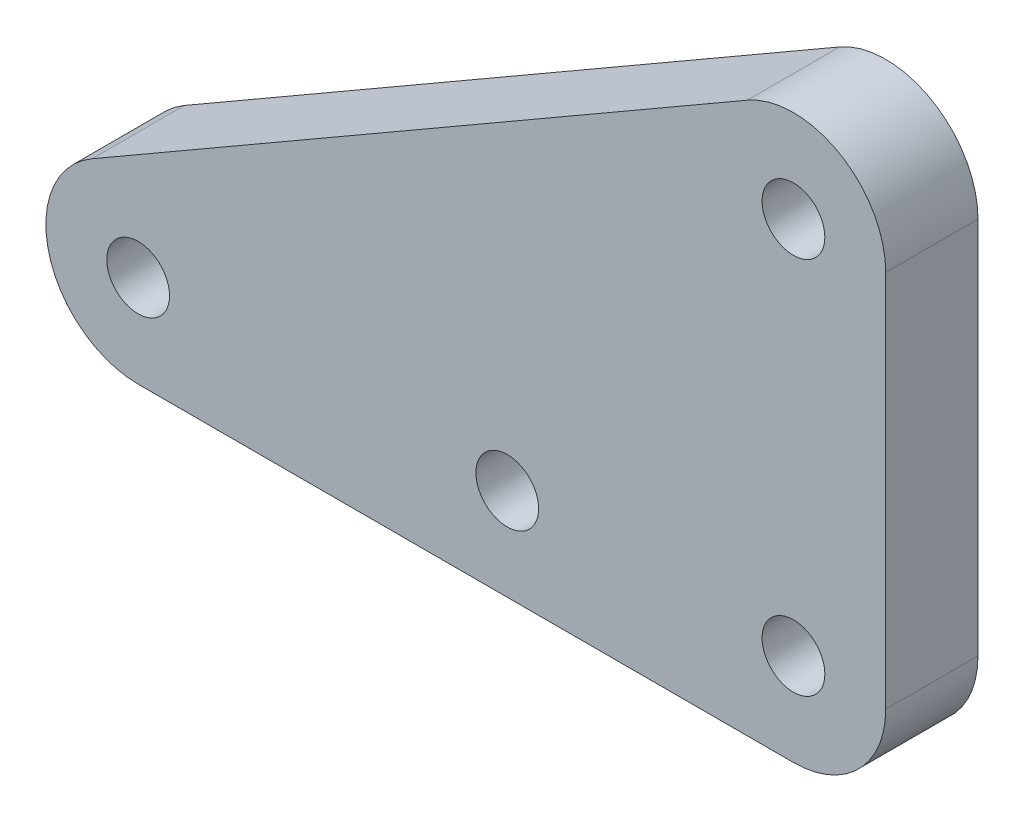
ISO-10303-21;
HEADER;
FILE_DESCRIPTION(('STEP AP214'),'2;1');
FILE_NAME('part.step','',(''),(''),'','','');
FILE_SCHEMA(('AUTOMOTIVE_DESIGN { 1 0 10303 214 1 1 1 1 }'));
ENDSEC;
DATA;
#1=APPLICATION_CONTEXT('core data for automotive mechanical design processes');
#2=APPLICATION_PROTOCOL_DEFINITION('international standard','automotive_design',2000,#1);
#3=PRODUCT_CONTEXT('',#1,'mechanical');
#4=PRODUCT('Part','Part','',(#3));
#5=PRODUCT_RELATED_PRODUCT_CATEGORY('part','',(#4));
#6=PRODUCT_DEFINITION_FORMATION('','',#4);
#7=PRODUCT_DEFINITION_CONTEXT('part definition',#1,'design');
#8=PRODUCT_DEFINITION('design','',#6,#7);
#9=PRODUCT_DEFINITION_SHAPE('','',#8);
#10=(LENGTH_UNIT() NAMED_UNIT(*) SI_UNIT(.MILLI.,.METRE.));
#11=(NAMED_UNIT(*) PLANE_ANGLE_UNIT() SI_UNIT($,.RADIAN.));
#12=(NAMED_UNIT(*) SI_UNIT($,.STERADIAN.) SOLID_ANGLE_UNIT());
#13=UNCERTAINTY_MEASURE_WITH_UNIT(LENGTH_MEASURE(1.E-05),#10,'distance_accuracy_value','');
#14=(GEOMETRIC_REPRESENTATION_CONTEXT(3) GLOBAL_UNCERTAINTY_ASSIGNED_CONTEXT((#13)) GLOBAL_UNIT_ASSIGNED_CONTEXT((#10,
#11,#12)) REPRESENTATION_CONTEXT('',''));
#15=CARTESIAN_POINT('',(0.,0.,0.));
#16=DIRECTION('',(0.,0.,1.));
#17=DIRECTION('',(1.,0.,0.));
#18=AXIS2_PLACEMENT_3D('',#15,#16,#17);
#19=CARTESIAN_POINT('',(35.507041555162,0.,5.));
#20=DIRECTION('',(0.,0.,-1.));
#21=DIRECTION('',(-1.,0.,0.));
#22=AXIS2_PLACEMENT_3D('',#19,#20,#21);
#23=CYLINDRICAL_SURFACE('',#22,5.);
#24=CARTESIAN_POINT('',(35.507041555162,0.,0.));
#25=DIRECTION('',(0.,0.,1.));
#26=DIRECTION('',(1.,0.,0.));
#27=AXIS2_PLACEMENT_3D('',#24,#25,#26);
#28=CIRCLE('',#27,5.);
#29=CARTESIAN_POINT('',(35.507041555162,-5.,0.));
#30=VERTEX_POINT('',#29);
#31=CARTESIAN_POINT('',(40.507041555162,0.,0.));
#32=VERTEX_POINT('',#31);
#33=EDGE_CURVE('E133',#30,#32,#28,.T.);
#34=ORIENTED_EDGE('',*,*,#33,.T.);
#35=DIRECTION('',(0.,0.,-1.));
#36=VECTOR('',#35,1.);
#37=CARTESIAN_POINT('',(40.507041555162,0.,5.));
#38=LINE('',#37,#36);
#39=CARTESIAN_POINT('',(40.507041555162,0.,5.));
#40=VERTEX_POINT('',#39);
#41=EDGE_CURVE('E11',#40,#32,#38,.T.);
#42=ORIENTED_EDGE('',*,*,#41,.F.);
#43=CARTESIAN_POINT('',(35.507041555162,0.,5.));
#44=DIRECTION('',(0.,0.,1.));
#45=DIRECTION('',(1.,0.,0.));
#46=AXIS2_PLACEMENT_3D('',#43,#44,#45);
#47=CIRCLE('',#46,5.);
#48=CARTESIAN_POINT('',(35.507041555162,-5.,5.));
#49=VERTEX_POINT('',#48);
#50=EDGE_CURVE('E85',#49,#40,#47,.T.);
#51=ORIENTED_EDGE('',*,*,#50,.F.);
#52=DIRECTION('',(0.,0.,-1.));
#53=VECTOR('',#52,1.);
#54=CARTESIAN_POINT('',(35.507041555162,-5.,5.));
#55=LINE('',#54,#53);
#56=EDGE_CURVE('E129',#49,#30,#55,.T.);
#57=ORIENTED_EDGE('',*,*,#56,.T.);
#58=EDGE_LOOP('',(#34,#42,#51,#57));
#59=FACE_BOUND('',#58,.T.);
#60=ADVANCED_FACE('F35',(#59),#23,.T.);
#61=CARTESIAN_POINT('',(40.507041555162,0.,5.));
#62=DIRECTION('',(1.,0.,0.));
#63=DIRECTION('',(0.,1.,0.));
#64=AXIS2_PLACEMENT_3D('',#61,#62,#63);
#65=PLANE('',#64);
#66=DIRECTION('',(0.,-1.,0.));
#67=VECTOR('',#66,1.);
#68=CARTESIAN_POINT('',(40.507041555162,0.,0.));
#69=LINE('',#68,#67);
#70=CARTESIAN_POINT('',(40.507041555162,20.5000000000001,0.));
#71=VERTEX_POINT('',#70);
#72=EDGE_CURVE('E136',#71,#32,#69,.T.);
#73=ORIENTED_EDGE('',*,*,#72,.F.);
#74=DIRECTION('',(0.,0.,-1.));
#75=VECTOR('',#74,1.);
#76=CARTESIAN_POINT('',(40.507041555162,20.5000000000001,5.));
#77=LINE('',#76,#75);
#78=CARTESIAN_POINT('',(40.507041555162,20.5000000000001,5.));
#79=VERTEX_POINT('',#78);
#80=EDGE_CURVE('E44',#79,#71,#77,.T.);
#81=ORIENTED_EDGE('',*,*,#80,.F.);
#82=DIRECTION('',(0.,-1.,0.));
#83=VECTOR('',#82,1.);
#84=CARTESIAN_POINT('',(40.507041555162,0.,5.));
#85=LINE('',#84,#83);
#86=EDGE_CURVE('E115',#79,#40,#85,.T.);
#87=ORIENTED_EDGE('',*,*,#86,.T.);
#88=ORIENTED_EDGE('',*,*,#41,.T.);
#89=EDGE_LOOP('',(#73,#81,#87,#88));
#90=FACE_BOUND('',#89,.T.);
#91=ADVANCED_FACE('F167',(#90),#65,.T.);
#92=CARTESIAN_POINT('',(35.507041555162,20.5000000000001,5.));
#93=DIRECTION('',(0.,0.,-1.));
#94=DIRECTION('',(-1.,0.,0.));
#95=AXIS2_PLACEMENT_3D('',#92,#93,#94);
#96=CYLINDRICAL_SURFACE('',#95,5.);
#97=CARTESIAN_POINT('',(35.507041555162,20.5000000000001,0.));
#98=DIRECTION('',(0.,0.,1.));
#99=DIRECTION('',(1.,0.,0.));
#100=AXIS2_PLACEMENT_3D('',#97,#98,#99);
#101=CIRCLE('',#100,5.);
#102=CARTESIAN_POINT('',(33.007041555162,24.8301270189223,0.));
#103=VERTEX_POINT('',#102);
#104=EDGE_CURVE('E139',#71,#103,#101,.T.);
#105=ORIENTED_EDGE('',*,*,#104,.T.);
#106=DIRECTION('',(0.,0.,-1.));
#107=VECTOR('',#106,1.);
#108=CARTESIAN_POINT('',(33.007041555162,24.8301270189223,5.));
#109=LINE('',#108,#107);
#110=CARTESIAN_POINT('',(33.007041555162,24.8301270189223,5.));
#111=VERTEX_POINT('',#110);
#112=EDGE_CURVE('E103',#111,#103,#109,.T.);
#113=ORIENTED_EDGE('',*,*,#112,.F.);
#114=CARTESIAN_POINT('',(35.507041555162,20.5000000000001,5.));
#115=DIRECTION('',(0.,0.,1.));
#116=DIRECTION('',(1.,0.,0.));
#117=AXIS2_PLACEMENT_3D('',#114,#115,#116);
#118=CIRCLE('',#117,5.);
#119=EDGE_CURVE('E112',#79,#111,#118,.T.);
#120=ORIENTED_EDGE('',*,*,#119,.F.);
#121=ORIENTED_EDGE('',*,*,#80,.T.);
#122=EDGE_LOOP('',(#105,#113,#120,#121));
#123=FACE_BOUND('',#122,.T.);
#124=ADVANCED_FACE('F159',(#123),#96,.T.);
#125=CARTESIAN_POINT('',(-2.50000000000001,4.33012701892219,5.));
#126=DIRECTION('',(-0.500000000000001,0.866025403784438,0.));
#127=DIRECTION('',(-0.866025403784438,-0.500000000000001,0.));
#128=AXIS2_PLACEMENT_3D('',#125,#126,#127);
#129=PLANE('',#128);
#130=DIRECTION('',(0.866025403784438,0.500000000000001,0.));
#131=VECTOR('',#130,1.);
#132=CARTESIAN_POINT('',(-2.50000000000001,4.33012701892219,0.));
#133=LINE('',#132,#131);
#134=CARTESIAN_POINT('',(-2.50000000000001,4.33012701892219,0.));
#135=VERTEX_POINT('',#134);
#136=EDGE_CURVE('E102',#135,#103,#133,.T.);
#137=ORIENTED_EDGE('',*,*,#136,.F.);
#138=DIRECTION('',(0.,0.,-1.));
#139=VECTOR('',#138,1.);
#140=CARTESIAN_POINT('',(-2.50000000000001,4.33012701892219,5.));
#141=LINE('',#140,#139);
#142=CARTESIAN_POINT('',(-2.50000000000001,4.33012701892219,5.));
#143=VERTEX_POINT('',#142);
#144=EDGE_CURVE('E96',#143,#135,#141,.T.);
#145=ORIENTED_EDGE('',*,*,#144,.F.);
#146=DIRECTION('',(0.866025403784438,0.500000000000001,0.));
#147=VECTOR('',#146,1.);
#148=CARTESIAN_POINT('',(-2.50000000000001,4.33012701892219,5.));
#149=LINE('',#148,#147);
#150=EDGE_CURVE('E100',#143,#111,#149,.T.);
#151=ORIENTED_EDGE('',*,*,#150,.T.);
#152=ORIENTED_EDGE('',*,*,#112,.T.);
#153=EDGE_LOOP('',(#137,#145,#151,#152));
#154=FACE_BOUND('',#153,.T.);
#155=ADVANCED_FACE('F98',(#154),#129,.T.);
#156=CARTESIAN_POINT('',(0.,0.,5.));
#157=DIRECTION('',(0.,0.,-1.));
#158=DIRECTION('',(-1.,0.,0.));
#159=AXIS2_PLACEMENT_3D('',#156,#157,#158);
#160=CYLINDRICAL_SURFACE('',#159,5.);
#161=CARTESIAN_POINT('',(0.,0.,0.));
#162=DIRECTION('',(0.,0.,1.));
#163=DIRECTION('',(1.,0.,0.));
#164=AXIS2_PLACEMENT_3D('',#161,#162,#163);
#165=CIRCLE('',#164,5.);
#166=CARTESIAN_POINT('',(0.,-5.,0.));
#167=VERTEX_POINT('',#166);
#168=EDGE_CURVE('E73',#135,#167,#165,.T.);
#169=ORIENTED_EDGE('',*,*,#168,.T.);
#170=DIRECTION('',(0.,0.,-1.));
#171=VECTOR('',#170,1.);
#172=CARTESIAN_POINT('',(0.,-5.,5.));
#173=LINE('',#172,#171);
#174=CARTESIAN_POINT('',(0.,-5.,5.));
#175=VERTEX_POINT('',#174);
#176=EDGE_CURVE('E104',#175,#167,#173,.T.);
#177=ORIENTED_EDGE('',*,*,#176,.F.);
#178=CARTESIAN_POINT('',(0.,0.,5.));
#179=DIRECTION('',(0.,0.,1.));
#180=DIRECTION('',(1.,0.,0.));
#181=AXIS2_PLACEMENT_3D('',#178,#179,#180);
#182=CIRCLE('',#181,5.);
#183=EDGE_CURVE('E106',#143,#175,#182,.T.);
#184=ORIENTED_EDGE('',*,*,#183,.F.);
#185=ORIENTED_EDGE('',*,*,#144,.T.);
#186=EDGE_LOOP('',(#169,#177,#184,#185));
#187=FACE_BOUND('',#186,.T.);
#188=ADVANCED_FACE('F107',(#187),#160,.T.);
#189=CARTESIAN_POINT('',(0.,0.,5.));
#190=DIRECTION('',(0.,0.,-1.));
#191=DIRECTION('',(-1.,0.,0.));
#192=AXIS2_PLACEMENT_3D('',#189,#190,#191);
#193=CYLINDRICAL_SURFACE('',#192,1.7);
#194=CARTESIAN_POINT('',(0.,0.,5.));
#195=DIRECTION('',(0.,0.,1.));
#196=DIRECTION('',(1.,0.,0.));
#197=AXIS2_PLACEMENT_3D('',#194,#195,#196);
#198=CIRCLE('',#197,1.7);
#199=CARTESIAN_POINT('',(1.7,0.,5.));
#200=VERTEX_POINT('',#199);
#201=EDGE_CURVE('E123',#200,#200,#198,.T.);
#202=ORIENTED_EDGE('',*,*,#201,.T.);
#203=EDGE_LOOP('',(#202));
#204=FACE_BOUND('',#203,.T.);
#205=CARTESIAN_POINT('',(0.,0.,0.));
#206=DIRECTION('',(0.,0.,1.));
#207=DIRECTION('',(1.,0.,0.));
#208=AXIS2_PLACEMENT_3D('',#205,#206,#207);
#209=CIRCLE('',#208,1.7);
#210=CARTESIAN_POINT('',(1.7,0.,0.));
#211=VERTEX_POINT('',#210);
#212=EDGE_CURVE('E148',#211,#211,#209,.T.);
#213=ORIENTED_EDGE('',*,*,#212,.F.);
#214=EDGE_LOOP('',(#213));
#215=FACE_BOUND('',#214,.T.);
#216=ADVANCED_FACE('F179',(#204,#215),#193,.F.);
#217=CARTESIAN_POINT('',(20.,0.,5.));
#218=DIRECTION('',(0.,0.,-1.));
#219=DIRECTION('',(-1.,0.,0.));
#220=AXIS2_PLACEMENT_3D('',#217,#218,#219);
#221=CYLINDRICAL_SURFACE('',#220,1.7);
#222=CARTESIAN_POINT('',(20.,0.,5.));
#223=DIRECTION('',(0.,0.,1.));
#224=DIRECTION('',(1.,0.,0.));
#225=AXIS2_PLACEMENT_3D('',#222,#223,#224);
#226=CIRCLE('',#225,1.7);
#227=CARTESIAN_POINT('',(21.7,0.,5.));
#228=VERTEX_POINT('',#227);
#229=EDGE_CURVE('E120',#228,#228,#226,.T.);
#230=ORIENTED_EDGE('',*,*,#229,.T.);
#231=EDGE_LOOP('',(#230));
#232=FACE_BOUND('',#231,.T.);
#233=CARTESIAN_POINT('',(20.,0.,0.));
#234=DIRECTION('',(0.,0.,1.));
#235=DIRECTION('',(1.,0.,0.));
#236=AXIS2_PLACEMENT_3D('',#233,#234,#235);
#237=CIRCLE('',#236,1.7);
#238=CARTESIAN_POINT('',(21.7,0.,0.));
#239=VERTEX_POINT('',#238);
#240=EDGE_CURVE('E145',#239,#239,#237,.T.);
#241=ORIENTED_EDGE('',*,*,#240,.F.);
#242=EDGE_LOOP('',(#241));
#243=FACE_BOUND('',#242,.T.);
#244=ADVANCED_FACE('F171',(#232,#243),#221,.F.);
#245=CARTESIAN_POINT('',(0.,-5.,5.));
#246=DIRECTION('',(0.,1.,0.));
#247=DIRECTION('',(0.,0.,1.));
#248=AXIS2_PLACEMENT_3D('',#245,#246,#247);
#249=PLANE('',#248);
#250=DIRECTION('',(1.,0.,0.));
#251=VECTOR('',#250,1.);
#252=CARTESIAN_POINT('',(0.,-5.,0.));
#253=LINE('',#252,#251);
#254=EDGE_CURVE('E79',#167,#30,#253,.T.);
#255=ORIENTED_EDGE('',*,*,#254,.T.);
#256=ORIENTED_EDGE('',*,*,#56,.F.);
#257=DIRECTION('',(1.,0.,0.));
#258=VECTOR('',#257,1.);
#259=CARTESIAN_POINT('',(0.,-5.,5.));
#260=LINE('',#259,#258);
#261=EDGE_CURVE('E52',#175,#49,#260,.T.);
#262=ORIENTED_EDGE('',*,*,#261,.F.);
#263=ORIENTED_EDGE('',*,*,#176,.T.);
#264=EDGE_LOOP('',(#255,#256,#262,#263));
#265=FACE_BOUND('',#264,.T.);
#266=ADVANCED_FACE('F169',(#265),#249,.F.);
#267=CARTESIAN_POINT('',(35.507041555162,0.,5.));
#268=DIRECTION('',(0.,0.,-1.));
#269=DIRECTION('',(-1.,0.,0.));
#270=AXIS2_PLACEMENT_3D('',#267,#268,#269);
#271=CYLINDRICAL_SURFACE('',#270,1.7);
#272=CARTESIAN_POINT('',(35.507041555162,0.,5.));
#273=DIRECTION('',(0.,0.,1.));
#274=DIRECTION('',(1.,0.,0.));
#275=AXIS2_PLACEMENT_3D('',#272,#273,#274);
#276=CIRCLE('',#275,1.7);
#277=CARTESIAN_POINT('',(37.207041555162,0.,5.));
#278=VERTEX_POINT('',#277);
#279=EDGE_CURVE('E154',#278,#278,#276,.T.);
#280=ORIENTED_EDGE('',*,*,#279,.T.);
#281=EDGE_LOOP('',(#280));
#282=FACE_BOUND('',#281,.T.);
#283=CARTESIAN_POINT('',(35.507041555162,0.,0.));
#284=DIRECTION('',(0.,0.,1.));
#285=DIRECTION('',(1.,0.,0.));
#286=AXIS2_PLACEMENT_3D('',#283,#284,#285);
#287=CIRCLE('',#286,1.7);
#288=CARTESIAN_POINT('',(37.207041555162,0.,0.));
#289=VERTEX_POINT('',#288);
#290=EDGE_CURVE('E130',#289,#289,#287,.T.);
#291=ORIENTED_EDGE('',*,*,#290,.F.);
#292=EDGE_LOOP('',(#291));
#293=FACE_BOUND('',#292,.T.);
#294=ADVANCED_FACE('F37',(#282,#293),#271,.F.);
#295=CARTESIAN_POINT('',(35.507041555162,20.5000000000001,5.));
#296=DIRECTION('',(0.,0.,-1.));
#297=DIRECTION('',(-1.,0.,0.));
#298=AXIS2_PLACEMENT_3D('',#295,#296,#297);
#299=CYLINDRICAL_SURFACE('',#298,1.7);
#300=CARTESIAN_POINT('',(35.507041555162,20.5000000000001,5.));
#301=DIRECTION('',(0.,0.,1.));
#302=DIRECTION('',(1.,0.,0.));
#303=AXIS2_PLACEMENT_3D('',#300,#301,#302);
#304=CIRCLE('',#303,1.7);
#305=CARTESIAN_POINT('',(37.207041555162,20.5000000000001,5.));
#306=VERTEX_POINT('',#305);
#307=EDGE_CURVE('E126',#306,#306,#304,.T.);
#308=ORIENTED_EDGE('',*,*,#307,.T.);
#309=EDGE_LOOP('',(#308));
#310=FACE_BOUND('',#309,.T.);
#311=CARTESIAN_POINT('',(35.507041555162,20.5000000000001,0.));
#312=DIRECTION('',(0.,0.,1.));
#313=DIRECTION('',(1.,0.,0.));
#314=AXIS2_PLACEMENT_3D('',#311,#312,#313);
#315=CIRCLE('',#314,1.7);
#316=CARTESIAN_POINT('',(37.207041555162,20.5000000000001,0.));
#317=VERTEX_POINT('',#316);
#318=EDGE_CURVE('E151',#317,#317,#315,.T.);
#319=ORIENTED_EDGE('',*,*,#318,.F.);
#320=EDGE_LOOP('',(#319));
#321=FACE_BOUND('',#320,.T.);
#322=ADVANCED_FACE('F177',(#310,#321),#299,.F.);
#323=CARTESIAN_POINT('',(0.,0.,5.));
#324=DIRECTION('',(0.,0.,1.));
#325=DIRECTION('',(1.,0.,0.));
#326=AXIS2_PLACEMENT_3D('',#323,#324,#325);
#327=PLANE('',#326);
#328=ORIENTED_EDGE('',*,*,#279,.F.);
#329=EDGE_LOOP('',(#328));
#330=FACE_BOUND('',#329,.T.);
#331=ORIENTED_EDGE('',*,*,#50,.T.);
#332=ORIENTED_EDGE('',*,*,#86,.F.);
#333=ORIENTED_EDGE('',*,*,#119,.T.);
#334=ORIENTED_EDGE('',*,*,#150,.F.);
#335=ORIENTED_EDGE('',*,*,#183,.T.);
#336=ORIENTED_EDGE('',*,*,#261,.T.);
#337=EDGE_LOOP('',(#331,#332,#333,#334,#335,#336));
#338=FACE_BOUND('',#337,.T.);
#339=ORIENTED_EDGE('',*,*,#229,.F.);
#340=EDGE_LOOP('',(#339));
#341=FACE_BOUND('',#340,.T.);
#342=ORIENTED_EDGE('',*,*,#201,.F.);
#343=EDGE_LOOP('',(#342));
#344=FACE_BOUND('',#343,.T.);
#345=ORIENTED_EDGE('',*,*,#307,.F.);
#346=EDGE_LOOP('',(#345));
#347=FACE_BOUND('',#346,.T.);
#348=ADVANCED_FACE('F109',(#330,#338,#341,#344,#347),#327,.T.);
#349=CARTESIAN_POINT('',(0.,0.,0.));
#350=DIRECTION('',(0.,0.,1.));
#351=DIRECTION('',(1.,0.,0.));
#352=AXIS2_PLACEMENT_3D('',#349,#350,#351);
#353=PLANE('',#352);
#354=ORIENTED_EDGE('',*,*,#290,.T.);
#355=EDGE_LOOP('',(#354));
#356=FACE_BOUND('',#355,.T.);
#357=ORIENTED_EDGE('',*,*,#33,.F.);
#358=ORIENTED_EDGE('',*,*,#254,.F.);
#359=ORIENTED_EDGE('',*,*,#168,.F.);
#360=ORIENTED_EDGE('',*,*,#136,.T.);
#361=ORIENTED_EDGE('',*,*,#104,.F.);
#362=ORIENTED_EDGE('',*,*,#72,.T.);
#363=EDGE_LOOP('',(#357,#358,#359,#360,#361,#362));
#364=FACE_BOUND('',#363,.T.);
#365=ORIENTED_EDGE('',*,*,#240,.T.);
#366=EDGE_LOOP('',(#365));
#367=FACE_BOUND('',#366,.T.);
#368=ORIENTED_EDGE('',*,*,#212,.T.);
#369=EDGE_LOOP('',(#368));
#370=FACE_BOUND('',#369,.T.);
#371=ORIENTED_EDGE('',*,*,#318,.T.);
#372=EDGE_LOOP('',(#371));
#373=FACE_BOUND('',#372,.T.);
#374=ADVANCED_FACE('F165',(#356,#364,#367,#370,#373),#353,.F.);
#375=CLOSED_SHELL('',(#60,#91,#124,#155,#188,#216,#244,#266,#294,#322,#348,#374));
#376=MANIFOLD_SOLID_BREP('B2',#375);
#377=ADVANCED_BREP_SHAPE_REPRESENTATION('',(#18,#376),#14);
#378=SHAPE_DEFINITION_REPRESENTATION(#9,#377);
ENDSEC;
END-ISO-10303-21;
